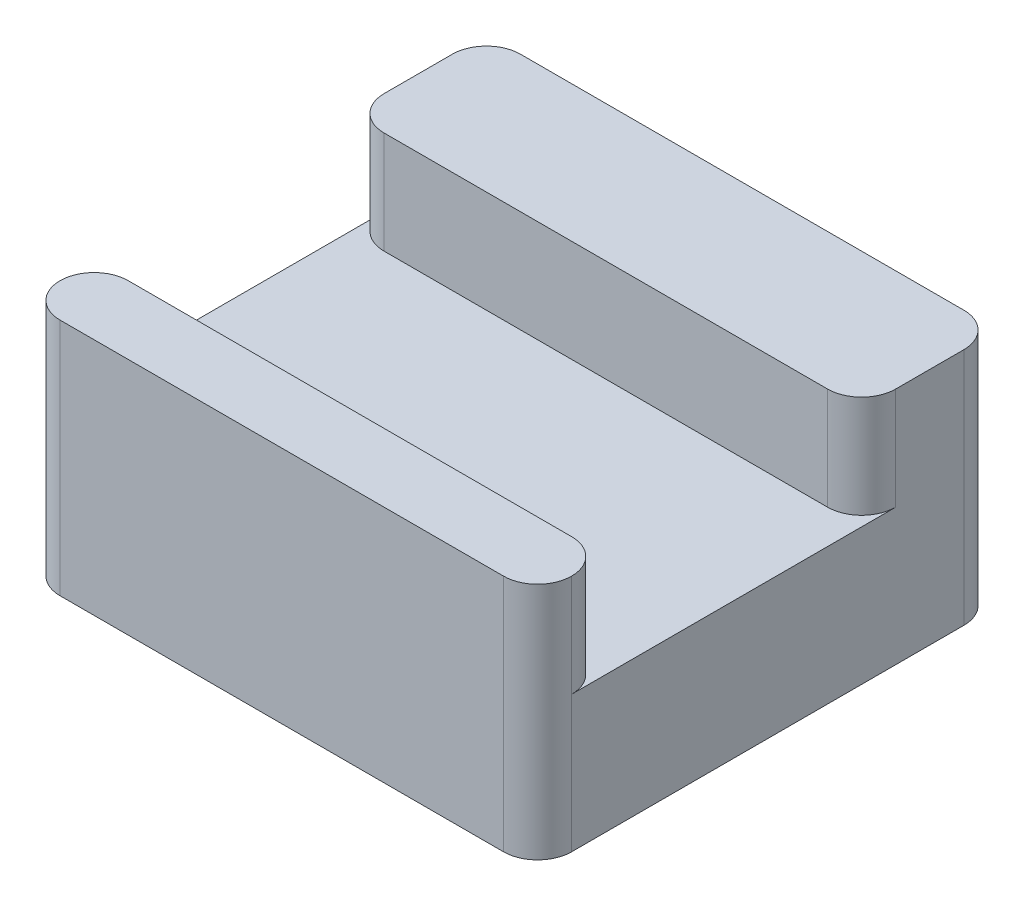
ISO-10303-21;
HEADER;
FILE_DESCRIPTION(('STEP AP214'),'2;1');
FILE_NAME('part.step','',(''),(''),'','','');
FILE_SCHEMA(('AUTOMOTIVE_DESIGN { 1 0 10303 214 1 1 1 1 }'));
ENDSEC;
DATA;
#1=APPLICATION_CONTEXT('core data for automotive mechanical design processes');
#2=APPLICATION_PROTOCOL_DEFINITION('international standard','automotive_design',2000,#1);
#3=PRODUCT_CONTEXT('',#1,'mechanical');
#4=PRODUCT('Part','Part','',(#3));
#5=PRODUCT_RELATED_PRODUCT_CATEGORY('part','',(#4));
#6=PRODUCT_DEFINITION_FORMATION('','',#4);
#7=PRODUCT_DEFINITION_CONTEXT('part definition',#1,'design');
#8=PRODUCT_DEFINITION('design','',#6,#7);
#9=PRODUCT_DEFINITION_SHAPE('','',#8);
#10=(LENGTH_UNIT() NAMED_UNIT(*) SI_UNIT(.MILLI.,.METRE.));
#11=(NAMED_UNIT(*) PLANE_ANGLE_UNIT() SI_UNIT($,.RADIAN.));
#12=(NAMED_UNIT(*) SI_UNIT($,.STERADIAN.) SOLID_ANGLE_UNIT());
#13=UNCERTAINTY_MEASURE_WITH_UNIT(LENGTH_MEASURE(1.E-05),#10,'distance_accuracy_value','');
#14=(GEOMETRIC_REPRESENTATION_CONTEXT(3) GLOBAL_UNCERTAINTY_ASSIGNED_CONTEXT((#13)) GLOBAL_UNIT_ASSIGNED_CONTEXT((#10,
#11,#12)) REPRESENTATION_CONTEXT('',''));
#15=CARTESIAN_POINT('',(0.,0.,0.));
#16=DIRECTION('',(0.,0.,1.));
#17=DIRECTION('',(1.,0.,0.));
#18=AXIS2_PLACEMENT_3D('',#15,#16,#17);
#19=CARTESIAN_POINT('',(0.,7.,0.));
#20=DIRECTION('',(0.,-1.,0.));
#21=DIRECTION('',(0.,0.,-1.));
#22=AXIS2_PLACEMENT_3D('',#19,#20,#21);
#23=PLANE('',#22);
#24=CARTESIAN_POINT('',(-6.5,7.,5.75));
#25=DIRECTION('',(0.,-1.,0.));
#26=DIRECTION('',(0.,0.,-1.));
#27=AXIS2_PLACEMENT_3D('',#24,#25,#26);
#28=CIRCLE('',#27,1.);
#29=CARTESIAN_POINT('',(-6.5,7.,4.75));
#30=VERTEX_POINT('',#29);
#31=CARTESIAN_POINT('',(-7.5,7.,5.75));
#32=VERTEX_POINT('',#31);
#33=EDGE_CURVE('E195',#30,#32,#28,.F.);
#34=ORIENTED_EDGE('',*,*,#33,.T.);
#35=CARTESIAN_POINT('',(-6.5,7.,5.75));
#36=DIRECTION('',(0.,-1.,0.));
#37=DIRECTION('',(0.,0.,-1.));
#38=AXIS2_PLACEMENT_3D('',#35,#36,#37);
#39=CIRCLE('',#38,1.);
#40=CARTESIAN_POINT('',(-6.5,7.,6.75));
#41=VERTEX_POINT('',#40);
#42=EDGE_CURVE('E197',#32,#41,#39,.F.);
#43=ORIENTED_EDGE('',*,*,#42,.T.);
#44=DIRECTION('',(1.,0.,0.));
#45=VECTOR('',#44,1.);
#46=CARTESIAN_POINT('',(-7.5,7.,6.75));
#47=LINE('',#46,#45);
#48=CARTESIAN_POINT('',(6.5,7.,6.75));
#49=VERTEX_POINT('',#48);
#50=EDGE_CURVE('E163',#41,#49,#47,.T.);
#51=ORIENTED_EDGE('',*,*,#50,.T.);
#52=CARTESIAN_POINT('',(6.5,7.,5.75));
#53=DIRECTION('',(0.,-1.,0.));
#54=DIRECTION('',(0.,0.,-1.));
#55=AXIS2_PLACEMENT_3D('',#52,#53,#54);
#56=CIRCLE('',#55,1.);
#57=CARTESIAN_POINT('',(7.5,7.,5.75));
#58=VERTEX_POINT('',#57);
#59=EDGE_CURVE('E191',#49,#58,#56,.F.);
#60=ORIENTED_EDGE('',*,*,#59,.T.);
#61=CARTESIAN_POINT('',(6.5,7.,5.75));
#62=DIRECTION('',(0.,-1.,0.));
#63=DIRECTION('',(0.,0.,-1.));
#64=AXIS2_PLACEMENT_3D('',#61,#62,#63);
#65=CIRCLE('',#64,1.);
#66=CARTESIAN_POINT('',(6.5,7.,4.75));
#67=VERTEX_POINT('',#66);
#68=EDGE_CURVE('E193',#58,#67,#65,.F.);
#69=ORIENTED_EDGE('',*,*,#68,.T.);
#70=DIRECTION('',(1.,0.,0.));
#71=VECTOR('',#70,1.);
#72=CARTESIAN_POINT('',(-7.5,7.,4.75));
#73=LINE('',#72,#71);
#74=EDGE_CURVE('E266',#30,#67,#73,.T.);
#75=ORIENTED_EDGE('',*,*,#74,.F.);
#76=EDGE_LOOP('',(#34,#43,#51,#60,#69,#75));
#77=FACE_BOUND('',#76,.T.);
#78=ADVANCED_FACE('F36',(#77),#23,.F.);
#79=CARTESIAN_POINT('',(7.5,7.,6.75));
#80=DIRECTION('',(-1.,0.,0.));
#81=DIRECTION('',(0.,0.,1.));
#82=AXIS2_PLACEMENT_3D('',#79,#80,#81);
#83=PLANE('',#82);
#84=DIRECTION('',(0.,0.,-1.));
#85=VECTOR('',#84,1.);
#86=CARTESIAN_POINT('',(7.5,0.,6.75));
#87=LINE('',#86,#85);
#88=CARTESIAN_POINT('',(7.5,0.,5.75));
#89=VERTEX_POINT('',#88);
#90=CARTESIAN_POINT('',(7.5,0.,-5.75));
#91=VERTEX_POINT('',#90);
#92=EDGE_CURVE('E250',#89,#91,#87,.T.);
#93=ORIENTED_EDGE('',*,*,#92,.T.);
#94=DIRECTION('',(0.,-1.,0.));
#95=VECTOR('',#94,1.);
#96=CARTESIAN_POINT('',(7.5,7.,-5.75));
#97=LINE('',#96,#95);
#98=CARTESIAN_POINT('',(7.5,7.,-5.75));
#99=VERTEX_POINT('',#98);
#100=EDGE_CURVE('E226',#91,#99,#97,.F.);
#101=ORIENTED_EDGE('',*,*,#100,.T.);
#102=DIRECTION('',(0.,0.,-1.));
#103=VECTOR('',#102,1.);
#104=CARTESIAN_POINT('',(7.5,7.,6.75));
#105=LINE('',#104,#103);
#106=CARTESIAN_POINT('',(7.5,7.,-3.75));
#107=VERTEX_POINT('',#106);
#108=EDGE_CURVE('E170',#107,#99,#105,.T.);
#109=ORIENTED_EDGE('',*,*,#108,.F.);
#110=DIRECTION('',(0.,1.,0.));
#111=VECTOR('',#110,1.);
#112=CARTESIAN_POINT('',(7.5,7.,-3.75));
#113=LINE('',#112,#111);
#114=CARTESIAN_POINT('',(7.5,4.,-3.75));
#115=VERTEX_POINT('',#114);
#116=EDGE_CURVE('E224',#107,#115,#113,.F.);
#117=ORIENTED_EDGE('',*,*,#116,.T.);
#118=DIRECTION('',(0.,0.,-1.));
#119=VECTOR('',#118,1.);
#120=CARTESIAN_POINT('',(7.5,4.,4.75));
#121=LINE('',#120,#119);
#122=CARTESIAN_POINT('',(7.5,4.,5.75));
#123=VERTEX_POINT('',#122);
#124=EDGE_CURVE('E52',#123,#115,#121,.T.);
#125=ORIENTED_EDGE('',*,*,#124,.F.);
#126=DIRECTION('',(0.,-1.,0.));
#127=VECTOR('',#126,1.);
#128=CARTESIAN_POINT('',(7.5,7.,5.75));
#129=LINE('',#128,#127);
#130=EDGE_CURVE('E222',#123,#89,#129,.T.);
#131=ORIENTED_EDGE('',*,*,#130,.T.);
#132=EDGE_LOOP('',(#93,#101,#109,#117,#125,#131));
#133=FACE_BOUND('',#132,.T.);
#134=ADVANCED_FACE('F249',(#133),#83,.F.);
#135=CARTESIAN_POINT('',(-7.5,7.,-6.75));
#136=DIRECTION('',(0.,0.,1.));
#137=DIRECTION('',(1.,0.,0.));
#138=AXIS2_PLACEMENT_3D('',#135,#136,#137);
#139=PLANE('',#138);
#140=CARTESIAN_POINT('',(0.,2.,-6.75));
#141=DIRECTION('',(0.,0.,-1.));
#142=DIRECTION('',(-1.,0.,0.));
#143=AXIS2_PLACEMENT_3D('',#140,#141,#142);
#144=CIRCLE('',#143,1.3);
#145=CARTESIAN_POINT('',(-1.3,2.,-6.75));
#146=VERTEX_POINT('',#145);
#147=EDGE_CURVE('E234',#146,#146,#144,.T.);
#148=ORIENTED_EDGE('',*,*,#147,.F.);
#149=EDGE_LOOP('',(#148));
#150=FACE_BOUND('',#149,.T.);
#151=DIRECTION('',(-1.,0.,0.));
#152=VECTOR('',#151,1.);
#153=CARTESIAN_POINT('',(-7.5,0.,-6.75));
#154=LINE('',#153,#152);
#155=CARTESIAN_POINT('',(6.5,0.,-6.75));
#156=VERTEX_POINT('',#155);
#157=CARTESIAN_POINT('',(-6.5,0.,-6.75));
#158=VERTEX_POINT('',#157);
#159=EDGE_CURVE('E176',#156,#158,#154,.T.);
#160=ORIENTED_EDGE('',*,*,#159,.T.);
#161=DIRECTION('',(0.,-1.,0.));
#162=VECTOR('',#161,1.);
#163=CARTESIAN_POINT('',(-6.5,7.,-6.75));
#164=LINE('',#163,#162);
#165=CARTESIAN_POINT('',(-6.5,7.,-6.75));
#166=VERTEX_POINT('',#165);
#167=EDGE_CURVE('E220',#158,#166,#164,.F.);
#168=ORIENTED_EDGE('',*,*,#167,.T.);
#169=DIRECTION('',(-1.,0.,0.));
#170=VECTOR('',#169,1.);
#171=CARTESIAN_POINT('',(-7.5,7.,-6.75));
#172=LINE('',#171,#170);
#173=CARTESIAN_POINT('',(6.5,7.,-6.75));
#174=VERTEX_POINT('',#173);
#175=EDGE_CURVE('E174',#174,#166,#172,.T.);
#176=ORIENTED_EDGE('',*,*,#175,.F.);
#177=DIRECTION('',(0.,-1.,0.));
#178=VECTOR('',#177,1.);
#179=CARTESIAN_POINT('',(6.5,7.,-6.75));
#180=LINE('',#179,#178);
#181=EDGE_CURVE('E217',#174,#156,#180,.T.);
#182=ORIENTED_EDGE('',*,*,#181,.T.);
#183=EDGE_LOOP('',(#160,#168,#176,#182));
#184=FACE_BOUND('',#183,.T.);
#185=ADVANCED_FACE('F289',(#150,#184),#139,.F.);
#186=CARTESIAN_POINT('',(-7.5,7.,6.75));
#187=DIRECTION('',(1.,0.,0.));
#188=DIRECTION('',(0.,0.,-1.));
#189=AXIS2_PLACEMENT_3D('',#186,#187,#188);
#190=PLANE('',#189);
#191=DIRECTION('',(0.,0.,1.));
#192=VECTOR('',#191,1.);
#193=CARTESIAN_POINT('',(-7.5,0.,6.75));
#194=LINE('',#193,#192);
#195=CARTESIAN_POINT('',(-7.5,0.,-5.75));
#196=VERTEX_POINT('',#195);
#197=CARTESIAN_POINT('',(-7.5,0.,5.75));
#198=VERTEX_POINT('',#197);
#199=EDGE_CURVE('E171',#196,#198,#194,.T.);
#200=ORIENTED_EDGE('',*,*,#199,.T.);
#201=DIRECTION('',(0.,-1.,0.));
#202=VECTOR('',#201,1.);
#203=CARTESIAN_POINT('',(-7.5,7.,5.75));
#204=LINE('',#203,#202);
#205=CARTESIAN_POINT('',(-7.5,4.,5.75));
#206=VERTEX_POINT('',#205);
#207=EDGE_CURVE('E148',#198,#206,#204,.F.);
#208=ORIENTED_EDGE('',*,*,#207,.T.);
#209=DIRECTION('',(0.,0.,1.));
#210=VECTOR('',#209,1.);
#211=CARTESIAN_POINT('',(-7.5,4.,4.75));
#212=LINE('',#211,#210);
#213=CARTESIAN_POINT('',(-7.5,4.,-3.75));
#214=VERTEX_POINT('',#213);
#215=EDGE_CURVE('E257',#214,#206,#212,.T.);
#216=ORIENTED_EDGE('',*,*,#215,.F.);
#217=DIRECTION('',(0.,1.,0.));
#218=VECTOR('',#217,1.);
#219=CARTESIAN_POINT('',(-7.5,7.,-3.75));
#220=LINE('',#219,#218);
#221=CARTESIAN_POINT('',(-7.5,7.,-3.75));
#222=VERTEX_POINT('',#221);
#223=EDGE_CURVE('E187',#214,#222,#220,.T.);
#224=ORIENTED_EDGE('',*,*,#223,.T.);
#225=DIRECTION('',(0.,0.,1.));
#226=VECTOR('',#225,1.);
#227=CARTESIAN_POINT('',(-7.5,7.,6.75));
#228=LINE('',#227,#226);
#229=CARTESIAN_POINT('',(-7.5,7.,-5.75));
#230=VERTEX_POINT('',#229);
#231=EDGE_CURVE('E261',#230,#222,#228,.T.);
#232=ORIENTED_EDGE('',*,*,#231,.F.);
#233=DIRECTION('',(0.,-1.,0.));
#234=VECTOR('',#233,1.);
#235=CARTESIAN_POINT('',(-7.5,7.,-5.75));
#236=LINE('',#235,#234);
#237=EDGE_CURVE('E153',#230,#196,#236,.T.);
#238=ORIENTED_EDGE('',*,*,#237,.T.);
#239=EDGE_LOOP('',(#200,#208,#216,#224,#232,#238));
#240=FACE_BOUND('',#239,.T.);
#241=ADVANCED_FACE('F292',(#240),#190,.F.);
#242=CARTESIAN_POINT('',(-7.5,7.,6.75));
#243=DIRECTION('',(0.,0.,-1.));
#244=DIRECTION('',(-1.,0.,0.));
#245=AXIS2_PLACEMENT_3D('',#242,#243,#244);
#246=PLANE('',#245);
#247=ORIENTED_EDGE('',*,*,#50,.F.);
#248=DIRECTION('',(0.,-1.,0.));
#249=VECTOR('',#248,1.);
#250=CARTESIAN_POINT('',(-6.5,7.,6.75));
#251=LINE('',#250,#249);
#252=CARTESIAN_POINT('',(-6.5,0.,6.75));
#253=VERTEX_POINT('',#252);
#254=EDGE_CURVE('E146',#41,#253,#251,.T.);
#255=ORIENTED_EDGE('',*,*,#254,.T.);
#256=DIRECTION('',(1.,0.,0.));
#257=VECTOR('',#256,1.);
#258=CARTESIAN_POINT('',(-7.5,0.,6.75));
#259=LINE('',#258,#257);
#260=CARTESIAN_POINT('',(6.5,0.,6.75));
#261=VERTEX_POINT('',#260);
#262=EDGE_CURVE('E160',#253,#261,#259,.T.);
#263=ORIENTED_EDGE('',*,*,#262,.T.);
#264=DIRECTION('',(0.,-1.,0.));
#265=VECTOR('',#264,1.);
#266=CARTESIAN_POINT('',(6.5,7.,6.75));
#267=LINE('',#266,#265);
#268=EDGE_CURVE('E165',#261,#49,#267,.F.);
#269=ORIENTED_EDGE('',*,*,#268,.T.);
#270=EDGE_LOOP('',(#247,#255,#263,#269));
#271=FACE_BOUND('',#270,.T.);
#272=ADVANCED_FACE('F159',(#271),#246,.F.);
#273=ORIENTED_EDGE('',*,*,#231,.T.);
#274=CARTESIAN_POINT('',(-6.5,7.,-3.75));
#275=DIRECTION('',(0.,-1.,0.));
#276=DIRECTION('',(0.,0.,-1.));
#277=AXIS2_PLACEMENT_3D('',#274,#275,#276);
#278=CIRCLE('',#277,1.);
#279=CARTESIAN_POINT('',(-6.5,7.,-2.75));
#280=VERTEX_POINT('',#279);
#281=EDGE_CURVE('E210',#222,#280,#278,.F.);
#282=ORIENTED_EDGE('',*,*,#281,.T.);
#283=DIRECTION('',(-1.,0.,0.));
#284=VECTOR('',#283,1.);
#285=CARTESIAN_POINT('',(-7.5,7.,-2.75));
#286=LINE('',#285,#284);
#287=CARTESIAN_POINT('',(6.5,7.,-2.75));
#288=VERTEX_POINT('',#287);
#289=EDGE_CURVE('E269',#288,#280,#286,.T.);
#290=ORIENTED_EDGE('',*,*,#289,.F.);
#291=CARTESIAN_POINT('',(6.5,7.,-3.75));
#292=DIRECTION('',(0.,-1.,0.));
#293=DIRECTION('',(0.,0.,-1.));
#294=AXIS2_PLACEMENT_3D('',#291,#292,#293);
#295=CIRCLE('',#294,1.);
#296=EDGE_CURVE('E204',#288,#107,#295,.F.);
#297=ORIENTED_EDGE('',*,*,#296,.T.);
#298=ORIENTED_EDGE('',*,*,#108,.T.);
#299=CARTESIAN_POINT('',(6.5,7.,-5.75));
#300=DIRECTION('',(0.,-1.,0.));
#301=DIRECTION('',(0.,0.,-1.));
#302=AXIS2_PLACEMENT_3D('',#299,#300,#301);
#303=CIRCLE('',#302,1.);
#304=EDGE_CURVE('E206',#99,#174,#303,.F.);
#305=ORIENTED_EDGE('',*,*,#304,.T.);
#306=ORIENTED_EDGE('',*,*,#175,.T.);
#307=CARTESIAN_POINT('',(-6.5,7.,-5.75));
#308=DIRECTION('',(0.,-1.,0.));
#309=DIRECTION('',(0.,0.,-1.));
#310=AXIS2_PLACEMENT_3D('',#307,#308,#309);
#311=CIRCLE('',#310,1.);
#312=EDGE_CURVE('E208',#166,#230,#311,.F.);
#313=ORIENTED_EDGE('',*,*,#312,.T.);
#314=EDGE_LOOP('',(#273,#282,#290,#297,#298,#305,#306,#313));
#315=FACE_BOUND('',#314,.T.);
#316=ADVANCED_FACE('F303',(#315),#23,.F.);
#317=CARTESIAN_POINT('',(0.,0.,0.));
#318=DIRECTION('',(0.,-1.,0.));
#319=DIRECTION('',(0.,0.,-1.));
#320=AXIS2_PLACEMENT_3D('',#317,#318,#319);
#321=PLANE('',#320);
#322=ORIENTED_EDGE('',*,*,#262,.F.);
#323=CARTESIAN_POINT('',(-6.5,0.,5.75));
#324=DIRECTION('',(0.,-1.,0.));
#325=DIRECTION('',(0.,0.,-1.));
#326=AXIS2_PLACEMENT_3D('',#323,#324,#325);
#327=CIRCLE('',#326,1.);
#328=EDGE_CURVE('E141',#253,#198,#327,.T.);
#329=ORIENTED_EDGE('',*,*,#328,.T.);
#330=ORIENTED_EDGE('',*,*,#199,.F.);
#331=CARTESIAN_POINT('',(-6.5,0.,-5.75));
#332=DIRECTION('',(0.,-1.,0.));
#333=DIRECTION('',(0.,0.,-1.));
#334=AXIS2_PLACEMENT_3D('',#331,#332,#333);
#335=CIRCLE('',#334,1.);
#336=EDGE_CURVE('E154',#196,#158,#335,.T.);
#337=ORIENTED_EDGE('',*,*,#336,.T.);
#338=ORIENTED_EDGE('',*,*,#159,.F.);
#339=CARTESIAN_POINT('',(6.5,0.,-5.75));
#340=DIRECTION('',(0.,-1.,0.));
#341=DIRECTION('',(0.,0.,-1.));
#342=AXIS2_PLACEMENT_3D('',#339,#340,#341);
#343=CIRCLE('',#342,1.);
#344=EDGE_CURVE('E182',#156,#91,#343,.T.);
#345=ORIENTED_EDGE('',*,*,#344,.T.);
#346=ORIENTED_EDGE('',*,*,#92,.F.);
#347=CARTESIAN_POINT('',(6.5,0.,5.75));
#348=DIRECTION('',(0.,-1.,0.));
#349=DIRECTION('',(0.,0.,-1.));
#350=AXIS2_PLACEMENT_3D('',#347,#348,#349);
#351=CIRCLE('',#350,1.);
#352=EDGE_CURVE('E164',#89,#261,#351,.T.);
#353=ORIENTED_EDGE('',*,*,#352,.T.);
#354=EDGE_LOOP('',(#322,#329,#330,#337,#338,#345,#346,#353));
#355=FACE_BOUND('',#354,.T.);
#356=ADVANCED_FACE('F167',(#355),#321,.T.);
#357=CARTESIAN_POINT('',(-7.5,4.,4.75));
#358=DIRECTION('',(0.,0.,1.));
#359=DIRECTION('',(1.,0.,0.));
#360=AXIS2_PLACEMENT_3D('',#357,#358,#359);
#361=PLANE('',#360);
#362=DIRECTION('',(1.,0.,0.));
#363=VECTOR('',#362,1.);
#364=CARTESIAN_POINT('',(-7.5,4.,4.75));
#365=LINE('',#364,#363);
#366=CARTESIAN_POINT('',(-6.5,4.,4.75));
#367=VERTEX_POINT('',#366);
#368=CARTESIAN_POINT('',(6.5,4.,4.75));
#369=VERTEX_POINT('',#368);
#370=EDGE_CURVE('E253',#367,#369,#365,.T.);
#371=ORIENTED_EDGE('',*,*,#370,.F.);
#372=DIRECTION('',(0.,1.,0.));
#373=VECTOR('',#372,1.);
#374=CARTESIAN_POINT('',(-6.5,4.,4.75));
#375=LINE('',#374,#373);
#376=EDGE_CURVE('E202',#367,#30,#375,.T.);
#377=ORIENTED_EDGE('',*,*,#376,.T.);
#378=ORIENTED_EDGE('',*,*,#74,.T.);
#379=DIRECTION('',(0.,1.,0.));
#380=VECTOR('',#379,1.);
#381=CARTESIAN_POINT('',(6.5,4.,4.75));
#382=LINE('',#381,#380);
#383=EDGE_CURVE('E199',#67,#369,#382,.F.);
#384=ORIENTED_EDGE('',*,*,#383,.T.);
#385=EDGE_LOOP('',(#371,#377,#378,#384));
#386=FACE_BOUND('',#385,.T.);
#387=ADVANCED_FACE('F345',(#386),#361,.F.);
#388=CARTESIAN_POINT('',(-7.5,4.,-2.75));
#389=DIRECTION('',(0.,0.,-1.));
#390=DIRECTION('',(-1.,0.,0.));
#391=AXIS2_PLACEMENT_3D('',#388,#389,#390);
#392=PLANE('',#391);
#393=ORIENTED_EDGE('',*,*,#289,.T.);
#394=DIRECTION('',(0.,1.,0.));
#395=VECTOR('',#394,1.);
#396=CARTESIAN_POINT('',(-6.5,4.,-2.75));
#397=LINE('',#396,#395);
#398=CARTESIAN_POINT('',(-6.5,4.,-2.75));
#399=VERTEX_POINT('',#398);
#400=EDGE_CURVE('E215',#280,#399,#397,.F.);
#401=ORIENTED_EDGE('',*,*,#400,.T.);
#402=DIRECTION('',(-1.,0.,0.));
#403=VECTOR('',#402,1.);
#404=CARTESIAN_POINT('',(-7.5,4.,-2.75));
#405=LINE('',#404,#403);
#406=CARTESIAN_POINT('',(6.5,4.,-2.75));
#407=VERTEX_POINT('',#406);
#408=EDGE_CURVE('E273',#407,#399,#405,.T.);
#409=ORIENTED_EDGE('',*,*,#408,.F.);
#410=DIRECTION('',(0.,1.,0.));
#411=VECTOR('',#410,1.);
#412=CARTESIAN_POINT('',(6.5,4.,-2.75));
#413=LINE('',#412,#411);
#414=EDGE_CURVE('E212',#407,#288,#413,.T.);
#415=ORIENTED_EDGE('',*,*,#414,.T.);
#416=EDGE_LOOP('',(#393,#401,#409,#415));
#417=FACE_BOUND('',#416,.T.);
#418=ADVANCED_FACE('F312',(#417),#392,.F.);
#419=CARTESIAN_POINT('',(0.,4.,0.));
#420=DIRECTION('',(0.,-1.,0.));
#421=DIRECTION('',(0.,0.,-1.));
#422=AXIS2_PLACEMENT_3D('',#419,#420,#421);
#423=PLANE('',#422);
#424=ORIENTED_EDGE('',*,*,#124,.T.);
#425=CARTESIAN_POINT('',(6.5,4.,-3.75));
#426=DIRECTION('',(0.,-1.,0.));
#427=DIRECTION('',(0.,0.,-1.));
#428=AXIS2_PLACEMENT_3D('',#425,#426,#427);
#429=CIRCLE('',#428,1.);
#430=EDGE_CURVE('E45',#115,#407,#429,.T.);
#431=ORIENTED_EDGE('',*,*,#430,.T.);
#432=ORIENTED_EDGE('',*,*,#408,.T.);
#433=CARTESIAN_POINT('',(-6.5,4.,-3.75));
#434=DIRECTION('',(0.,-1.,0.));
#435=DIRECTION('',(0.,0.,-1.));
#436=AXIS2_PLACEMENT_3D('',#433,#434,#435);
#437=CIRCLE('',#436,1.);
#438=EDGE_CURVE('E230',#399,#214,#437,.T.);
#439=ORIENTED_EDGE('',*,*,#438,.T.);
#440=ORIENTED_EDGE('',*,*,#215,.T.);
#441=CARTESIAN_POINT('',(-6.5,4.,5.75));
#442=DIRECTION('',(0.,-1.,0.));
#443=DIRECTION('',(0.,0.,-1.));
#444=AXIS2_PLACEMENT_3D('',#441,#442,#443);
#445=CIRCLE('',#444,1.);
#446=EDGE_CURVE('E228',#206,#367,#445,.T.);
#447=ORIENTED_EDGE('',*,*,#446,.T.);
#448=ORIENTED_EDGE('',*,*,#370,.T.);
#449=CARTESIAN_POINT('',(6.5,4.,5.75));
#450=DIRECTION('',(0.,-1.,0.));
#451=DIRECTION('',(0.,0.,-1.));
#452=AXIS2_PLACEMENT_3D('',#449,#450,#451);
#453=CIRCLE('',#452,1.);
#454=EDGE_CURVE('E11',#369,#123,#453,.T.);
#455=ORIENTED_EDGE('',*,*,#454,.T.);
#456=EDGE_LOOP('',(#424,#431,#432,#439,#440,#447,#448,#455));
#457=FACE_BOUND('',#456,.T.);
#458=ADVANCED_FACE('F285',(#457),#423,.F.);
#459=CARTESIAN_POINT('',(0.,2.,3.75));
#460=DIRECTION('',(0.,0.,-1.));
#461=DIRECTION('',(-1.,0.,0.));
#462=AXIS2_PLACEMENT_3D('',#459,#460,#461);
#463=CYLINDRICAL_SURFACE('',#462,1.3);
#464=CARTESIAN_POINT('',(0.,2.,3.75));
#465=DIRECTION('',(0.,0.,-1.));
#466=DIRECTION('',(-1.,0.,0.));
#467=AXIS2_PLACEMENT_3D('',#464,#465,#466);
#468=CIRCLE('',#467,1.3);
#469=CARTESIAN_POINT('',(-1.3,2.,3.75));
#470=VERTEX_POINT('',#469);
#471=EDGE_CURVE('E237',#470,#470,#468,.T.);
#472=CARTESIAN_POINT('',(-1.3,2.,3.75));
#473=CARTESIAN_POINT('',(-1.3,2.,3.640625));
#474=CARTESIAN_POINT('',(-1.3,2.,3.53125));
#475=CARTESIAN_POINT('',(-1.3,2.,3.3125));
#476=CARTESIAN_POINT('',(-1.3,2.,3.203125));
#477=CARTESIAN_POINT('',(-1.3,2.,2.984375));
#478=CARTESIAN_POINT('',(-1.3,2.,2.875));
#479=CARTESIAN_POINT('',(-1.3,2.,2.65625));
#480=CARTESIAN_POINT('',(-1.3,2.,2.546875));
#481=CARTESIAN_POINT('',(-1.3,2.,2.328125));
#482=CARTESIAN_POINT('',(-1.3,2.,2.21875));
#483=CARTESIAN_POINT('',(-1.3,2.,2.));
#484=CARTESIAN_POINT('',(-1.3,2.,1.890625));
#485=CARTESIAN_POINT('',(-1.3,2.,1.671875));
#486=CARTESIAN_POINT('',(-1.3,2.,1.5625));
#487=CARTESIAN_POINT('',(-1.3,2.,1.34375));
#488=CARTESIAN_POINT('',(-1.3,2.,1.234375));
#489=CARTESIAN_POINT('',(-1.3,2.,1.015625));
#490=CARTESIAN_POINT('',(-1.3,2.,0.906250000000001));
#491=CARTESIAN_POINT('',(-1.3,2.,0.687500000000001));
#492=CARTESIAN_POINT('',(-1.3,2.,0.578125000000001));
#493=CARTESIAN_POINT('',(-1.3,2.,0.359375000000001));
#494=CARTESIAN_POINT('',(-1.3,2.,0.250000000000001));
#495=CARTESIAN_POINT('',(-1.3,2.,0.0312500000000008));
#496=CARTESIAN_POINT('',(-1.3,2.,-0.0781249999999992));
#497=CARTESIAN_POINT('',(-1.3,2.,-0.296874999999999));
#498=CARTESIAN_POINT('',(-1.3,2.,-0.40625));
#499=CARTESIAN_POINT('',(-1.3,2.,-0.624999999999999));
#500=CARTESIAN_POINT('',(-1.3,2.,-0.734374999999999));
#501=CARTESIAN_POINT('',(-1.3,2.,-0.953124999999999));
#502=CARTESIAN_POINT('',(-1.3,2.,-1.0625));
#503=CARTESIAN_POINT('',(-1.3,2.,-1.28125));
#504=CARTESIAN_POINT('',(-1.3,2.,-1.390625));
#505=CARTESIAN_POINT('',(-1.3,2.,-1.609375));
#506=CARTESIAN_POINT('',(-1.3,2.,-1.71875));
#507=CARTESIAN_POINT('',(-1.3,2.,-1.9375));
#508=CARTESIAN_POINT('',(-1.3,2.,-2.046875));
#509=CARTESIAN_POINT('',(-1.3,2.,-2.265625));
#510=CARTESIAN_POINT('',(-1.3,2.,-2.375));
#511=CARTESIAN_POINT('',(-1.3,2.,-2.59375));
#512=CARTESIAN_POINT('',(-1.3,2.,-2.703125));
#513=CARTESIAN_POINT('',(-1.3,2.,-2.921875));
#514=CARTESIAN_POINT('',(-1.3,2.,-3.03125));
#515=CARTESIAN_POINT('',(-1.3,2.,-3.25));
#516=CARTESIAN_POINT('',(-1.3,2.,-3.359375));
#517=CARTESIAN_POINT('',(-1.3,2.,-3.578125));
#518=CARTESIAN_POINT('',(-1.3,2.,-3.6875));
#519=CARTESIAN_POINT('',(-1.3,2.,-3.90625));
#520=CARTESIAN_POINT('',(-1.3,2.,-4.015625));
#521=CARTESIAN_POINT('',(-1.3,2.,-4.234375));
#522=CARTESIAN_POINT('',(-1.3,2.,-4.34375));
#523=CARTESIAN_POINT('',(-1.3,2.,-4.5625));
#524=CARTESIAN_POINT('',(-1.3,2.,-4.671875));
#525=CARTESIAN_POINT('',(-1.3,2.,-4.890625));
#526=CARTESIAN_POINT('',(-1.3,2.,-5.));
#527=CARTESIAN_POINT('',(-1.3,2.,-5.21875));
#528=CARTESIAN_POINT('',(-1.3,2.,-5.328125));
#529=CARTESIAN_POINT('',(-1.3,2.,-5.546875));
#530=CARTESIAN_POINT('',(-1.3,2.,-5.65625));
#531=CARTESIAN_POINT('',(-1.3,2.,-5.875));
#532=CARTESIAN_POINT('',(-1.3,2.,-5.984375));
#533=CARTESIAN_POINT('',(-1.3,2.,-6.203125));
#534=CARTESIAN_POINT('',(-1.3,2.,-6.3125));
#535=CARTESIAN_POINT('',(-1.3,2.,-6.53125));
#536=CARTESIAN_POINT('',(-1.3,2.,-6.640625));
#537=CARTESIAN_POINT('',(-1.3,2.,-6.75));
#538=B_SPLINE_CURVE_WITH_KNOTS('',3,(#472,#473,#474,#475,#476,#477,#478,#479,#480,#481,#482,
#483,#484,#485,#486,#487,#488,#489,#490,#491,#492,#493,#494,#495,#496,#497,#498,#499,#500,#501,
#502,#503,#504,#505,#506,#507,#508,#509,#510,#511,#512,#513,#514,#515,#516,#517,#518,#519,#520,
#521,#522,#523,#524,#525,#526,#527,#528,#529,#530,#531,#532,#533,#534,#535,#536,#537),
.UNSPECIFIED.,.F.,.F.,(4,2,2,2,2,2,2,2,2,2,2,2,2,2,2,2,2,2,2,2,2,2,2,2,2,2,2,2,2,2,2,2,4),(0.,
0.328125,0.65625,0.984375,1.3125,1.640625,1.96875,2.296875,2.625,2.953125,3.28125,3.609375,
3.9375,4.265625,4.59375,4.921875,5.25,5.578125,5.90625,6.234375,6.5625,6.890625,7.21875,
7.546875,7.875,8.203125,8.53125,8.859375,9.1875,9.515625,9.84375,10.171875,10.5),.UNSPECIFIED.);
#539=EDGE_CURVE('BSEAM282',#470,#146,#538,.T.);
#540=ORIENTED_EDGE('',*,*,#471,.F.);
#541=ORIENTED_EDGE('',*,*,#147,.T.);
#542=ORIENTED_EDGE('',*,*,#539,.T.);
#543=ORIENTED_EDGE('',*,*,#539,.F.);
#544=EDGE_LOOP('',(#540,#542,#541,#543));
#545=FACE_BOUND('',#544,.T.);
#546=ADVANCED_FACE('F282',(#545),#463,.F.);
#547=CARTESIAN_POINT('',(0.,2.,3.75));
#548=DIRECTION('',(0.,0.,-1.));
#549=DIRECTION('',(-1.,0.,0.));
#550=AXIS2_PLACEMENT_3D('',#547,#548,#549);
#551=PLANE('',#550);
#552=ORIENTED_EDGE('',*,*,#471,.T.);
#553=EDGE_LOOP('',(#552));
#554=FACE_BOUND('',#553,.T.);
#555=ADVANCED_FACE('F280',(#554),#551,.T.);
#556=CARTESIAN_POINT('',(-6.5,4.,5.75));
#557=DIRECTION('',(0.,1.,0.));
#558=DIRECTION('',(0.,0.,1.));
#559=AXIS2_PLACEMENT_3D('',#556,#557,#558);
#560=CYLINDRICAL_SURFACE('',#559,1.);
#561=ORIENTED_EDGE('',*,*,#376,.F.);
#562=ORIENTED_EDGE('',*,*,#446,.F.);
#563=DIRECTION('',(0.,1.,0.));
#564=VECTOR('',#563,1.);
#565=CARTESIAN_POINT('',(-7.5,7.,5.75));
#566=LINE('',#565,#564);
#567=EDGE_CURVE('E233',#32,#206,#566,.F.);
#568=ORIENTED_EDGE('',*,*,#567,.F.);
#569=ORIENTED_EDGE('',*,*,#33,.F.);
#570=EDGE_LOOP('',(#561,#562,#568,#569));
#571=FACE_BOUND('',#570,.T.);
#572=ADVANCED_FACE('F354',(#571),#560,.T.);
#573=CARTESIAN_POINT('',(-6.5,7.,5.75));
#574=DIRECTION('',(0.,-1.,0.));
#575=DIRECTION('',(0.,0.,-1.));
#576=AXIS2_PLACEMENT_3D('',#573,#574,#575);
#577=CYLINDRICAL_SURFACE('',#576,1.);
#578=ORIENTED_EDGE('',*,*,#567,.T.);
#579=ORIENTED_EDGE('',*,*,#207,.F.);
#580=ORIENTED_EDGE('',*,*,#328,.F.);
#581=ORIENTED_EDGE('',*,*,#254,.F.);
#582=ORIENTED_EDGE('',*,*,#42,.F.);
#583=EDGE_LOOP('',(#578,#579,#580,#581,#582));
#584=FACE_BOUND('',#583,.T.);
#585=ADVANCED_FACE('F144',(#584),#577,.T.);
#586=CARTESIAN_POINT('',(-6.5,7.,-3.75));
#587=DIRECTION('',(0.,1.,0.));
#588=DIRECTION('',(0.,0.,1.));
#589=AXIS2_PLACEMENT_3D('',#586,#587,#588);
#590=CYLINDRICAL_SURFACE('',#589,1.);
#591=ORIENTED_EDGE('',*,*,#438,.F.);
#592=ORIENTED_EDGE('',*,*,#400,.F.);
#593=ORIENTED_EDGE('',*,*,#281,.F.);
#594=ORIENTED_EDGE('',*,*,#223,.F.);
#595=EDGE_LOOP('',(#591,#592,#593,#594));
#596=FACE_BOUND('',#595,.T.);
#597=ADVANCED_FACE('F308',(#596),#590,.T.);
#598=CARTESIAN_POINT('',(-6.5,7.,-5.75));
#599=DIRECTION('',(0.,-1.,0.));
#600=DIRECTION('',(0.,0.,-1.));
#601=AXIS2_PLACEMENT_3D('',#598,#599,#600);
#602=CYLINDRICAL_SURFACE('',#601,1.);
#603=ORIENTED_EDGE('',*,*,#312,.F.);
#604=ORIENTED_EDGE('',*,*,#167,.F.);
#605=ORIENTED_EDGE('',*,*,#336,.F.);
#606=ORIENTED_EDGE('',*,*,#237,.F.);
#607=EDGE_LOOP('',(#603,#604,#605,#606));
#608=FACE_BOUND('',#607,.T.);
#609=ADVANCED_FACE('F299',(#608),#602,.T.);
#610=CARTESIAN_POINT('',(6.5,7.,-5.75));
#611=DIRECTION('',(0.,-1.,0.));
#612=DIRECTION('',(0.,0.,-1.));
#613=AXIS2_PLACEMENT_3D('',#610,#611,#612);
#614=CYLINDRICAL_SURFACE('',#613,1.);
#615=ORIENTED_EDGE('',*,*,#304,.F.);
#616=ORIENTED_EDGE('',*,*,#100,.F.);
#617=ORIENTED_EDGE('',*,*,#344,.F.);
#618=ORIENTED_EDGE('',*,*,#181,.F.);
#619=EDGE_LOOP('',(#615,#616,#617,#618));
#620=FACE_BOUND('',#619,.T.);
#621=ADVANCED_FACE('F322',(#620),#614,.T.);
#622=CARTESIAN_POINT('',(6.5,4.,-3.75));
#623=DIRECTION('',(0.,1.,0.));
#624=DIRECTION('',(0.,0.,1.));
#625=AXIS2_PLACEMENT_3D('',#622,#623,#624);
#626=CYLINDRICAL_SURFACE('',#625,1.);
#627=ORIENTED_EDGE('',*,*,#430,.F.);
#628=ORIENTED_EDGE('',*,*,#116,.F.);
#629=ORIENTED_EDGE('',*,*,#296,.F.);
#630=ORIENTED_EDGE('',*,*,#414,.F.);
#631=EDGE_LOOP('',(#627,#628,#629,#630));
#632=FACE_BOUND('',#631,.T.);
#633=ADVANCED_FACE('F317',(#632),#626,.T.);
#634=CARTESIAN_POINT('',(6.5,7.,5.75));
#635=DIRECTION('',(0.,-1.,0.));
#636=DIRECTION('',(0.,0.,-1.));
#637=AXIS2_PLACEMENT_3D('',#634,#635,#636);
#638=CYLINDRICAL_SURFACE('',#637,1.);
#639=ORIENTED_EDGE('',*,*,#352,.F.);
#640=ORIENTED_EDGE('',*,*,#130,.F.);
#641=DIRECTION('',(0.,-1.,0.));
#642=VECTOR('',#641,1.);
#643=CARTESIAN_POINT('',(7.5,7.,5.75));
#644=LINE('',#643,#642);
#645=EDGE_CURVE('E40',#58,#123,#644,.T.);
#646=ORIENTED_EDGE('',*,*,#645,.F.);
#647=ORIENTED_EDGE('',*,*,#59,.F.);
#648=ORIENTED_EDGE('',*,*,#268,.F.);
#649=EDGE_LOOP('',(#639,#640,#646,#647,#648));
#650=FACE_BOUND('',#649,.T.);
#651=ADVANCED_FACE('F38',(#650),#638,.T.);
#652=CARTESIAN_POINT('',(6.5,7.,5.75));
#653=DIRECTION('',(0.,1.,0.));
#654=DIRECTION('',(0.,0.,1.));
#655=AXIS2_PLACEMENT_3D('',#652,#653,#654);
#656=CYLINDRICAL_SURFACE('',#655,1.);
#657=ORIENTED_EDGE('',*,*,#454,.F.);
#658=ORIENTED_EDGE('',*,*,#383,.F.);
#659=ORIENTED_EDGE('',*,*,#68,.F.);
#660=ORIENTED_EDGE('',*,*,#645,.T.);
#661=EDGE_LOOP('',(#657,#658,#659,#660));
#662=FACE_BOUND('',#661,.T.);
#663=ADVANCED_FACE('F243',(#662),#656,.T.);
#664=CLOSED_SHELL('',(#78,#134,#185,#241,#272,#316,#356,#387,#418,#458,#546,#555,#572,#585,#597,
#609,#621,#633,#651,#663));
#665=MANIFOLD_SOLID_BREP('B2',#664);
#666=ADVANCED_BREP_SHAPE_REPRESENTATION('',(#18,#665),#14);
#667=SHAPE_DEFINITION_REPRESENTATION(#9,#666);
ENDSEC;
END-ISO-10303-21;
